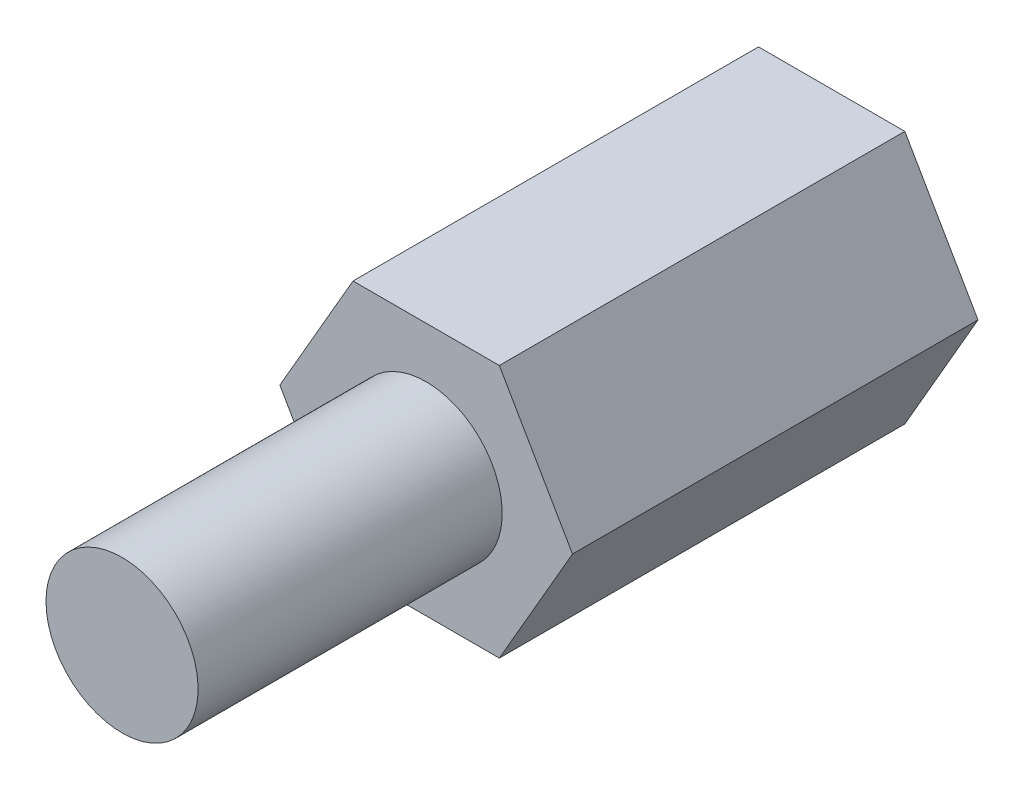
ISO-10303-21;
HEADER;
FILE_DESCRIPTION(('STEP AP214'),'2;1');
FILE_NAME('part.step','',(''),(''),'','','');
FILE_SCHEMA(('AUTOMOTIVE_DESIGN { 1 0 10303 214 1 1 1 1 }'));
ENDSEC;
DATA;
#1=APPLICATION_CONTEXT('core data for automotive mechanical design processes');
#2=APPLICATION_PROTOCOL_DEFINITION('international standard','automotive_design',2000,#1);
#3=PRODUCT_CONTEXT('',#1,'mechanical');
#4=PRODUCT('Part','Part','',(#3));
#5=PRODUCT_RELATED_PRODUCT_CATEGORY('part','',(#4));
#6=PRODUCT_DEFINITION_FORMATION('','',#4);
#7=PRODUCT_DEFINITION_CONTEXT('part definition',#1,'design');
#8=PRODUCT_DEFINITION('design','',#6,#7);
#9=PRODUCT_DEFINITION_SHAPE('','',#8);
#10=(LENGTH_UNIT() NAMED_UNIT(*) SI_UNIT(.MILLI.,.METRE.));
#11=(NAMED_UNIT(*) PLANE_ANGLE_UNIT() SI_UNIT($,.RADIAN.));
#12=(NAMED_UNIT(*) SI_UNIT($,.STERADIAN.) SOLID_ANGLE_UNIT());
#13=UNCERTAINTY_MEASURE_WITH_UNIT(LENGTH_MEASURE(1.E-05),#10,'distance_accuracy_value','');
#14=(GEOMETRIC_REPRESENTATION_CONTEXT(3) GLOBAL_UNCERTAINTY_ASSIGNED_CONTEXT((#13)) GLOBAL_UNIT_ASSIGNED_CONTEXT((#10,
#11,#12)) REPRESENTATION_CONTEXT('',''));
#15=CARTESIAN_POINT('',(0.,0.,0.));
#16=DIRECTION('',(0.,0.,1.));
#17=DIRECTION('',(1.,0.,0.));
#18=AXIS2_PLACEMENT_3D('',#15,#16,#17);
#19=CARTESIAN_POINT('',(1.44337567297406,-2.49999999999998,7.99999999999985));
#20=DIRECTION('',(0.,0.,0.999999999999998));
#21=DIRECTION('',(1.,0.,0.));
#22=AXIS2_PLACEMENT_3D('',#19,#20,#21);
#23=PLANE('',#22);
#24=DIRECTION('',(1.,0.,0.));
#25=VECTOR('',#24,1.);
#26=CARTESIAN_POINT('',(-1.4433756729741,-2.49999999999999,7.99999999999985));
#27=LINE('',#26,#25);
#28=CARTESIAN_POINT('',(-1.4433756729741,-2.49999999999999,7.99999999999985));
#29=VERTEX_POINT('',#28);
#30=CARTESIAN_POINT('',(1.44337567297406,-2.49999999999998,7.99999999999985));
#31=VERTEX_POINT('',#30);
#32=EDGE_CURVE('E119',#29,#31,#27,.T.);
#33=ORIENTED_EDGE('',*,*,#32,.T.);
#34=DIRECTION('',(0.499999999999999,0.86602540378444,0.));
#35=VECTOR('',#34,1.);
#36=CARTESIAN_POINT('',(1.44337567297406,-2.49999999999998,7.99999999999985));
#37=LINE('',#36,#35);
#38=CARTESIAN_POINT('',(2.88675134594814,0.,7.99999999999985));
#39=VERTEX_POINT('',#38);
#40=EDGE_CURVE('E121',#31,#39,#37,.T.);
#41=ORIENTED_EDGE('',*,*,#40,.T.);
#42=DIRECTION('',(-0.500000000000001,0.86602540378444,0.));
#43=VECTOR('',#42,1.);
#44=CARTESIAN_POINT('',(2.88675134594814,0.,7.99999999999985));
#45=LINE('',#44,#43);
#46=CARTESIAN_POINT('',(1.44337567297407,2.50000000000003,7.99999999999985));
#47=VERTEX_POINT('',#46);
#48=EDGE_CURVE('E123',#39,#47,#45,.T.);
#49=ORIENTED_EDGE('',*,*,#48,.T.);
#50=DIRECTION('',(-1.,0.,0.));
#51=VECTOR('',#50,1.);
#52=CARTESIAN_POINT('',(1.44337567297407,2.50000000000003,7.99999999999985));
#53=LINE('',#52,#51);
#54=CARTESIAN_POINT('',(-1.44337567297408,2.50000000000004,7.9999999999998));
#55=VERTEX_POINT('',#54);
#56=EDGE_CURVE('E125',#47,#55,#53,.T.);
#57=ORIENTED_EDGE('',*,*,#56,.T.);
#58=DIRECTION('',(-0.500000000000001,-0.86602540378444,0.));
#59=VECTOR('',#58,1.);
#60=CARTESIAN_POINT('',(-1.44337567297408,2.50000000000004,7.9999999999998));
#61=LINE('',#60,#59);
#62=CARTESIAN_POINT('',(-2.88675134594816,0.,7.99999999999985));
#63=VERTEX_POINT('',#62);
#64=EDGE_CURVE('E52',#55,#63,#61,.T.);
#65=ORIENTED_EDGE('',*,*,#64,.T.);
#66=DIRECTION('',(0.500000000000001,-0.866025403784441,0.));
#67=VECTOR('',#66,1.);
#68=CARTESIAN_POINT('',(-2.88675134594816,0.,7.99999999999985));
#69=LINE('',#68,#67);
#70=EDGE_CURVE('E47',#63,#29,#69,.T.);
#71=ORIENTED_EDGE('',*,*,#70,.T.);
#72=EDGE_LOOP('',(#33,#41,#49,#57,#65,#71));
#73=FACE_BOUND('',#72,.T.);
#74=CARTESIAN_POINT('',(0.,0.,7.99999999999985));
#75=DIRECTION('',(0.,0.,0.999999999999998));
#76=DIRECTION('',(1.,0.,0.));
#77=AXIS2_PLACEMENT_3D('',#74,#75,#76);
#78=CIRCLE('',#77,1.5);
#79=CARTESIAN_POINT('',(-1.50000000000002,0.,7.99999999999985));
#80=VERTEX_POINT('',#79);
#81=EDGE_CURVE('E98',#80,#80,#78,.T.);
#82=ORIENTED_EDGE('',*,*,#81,.F.);
#83=EDGE_LOOP('',(#82));
#84=FACE_BOUND('',#83,.T.);
#85=ADVANCED_FACE('F32',(#73,#84),#23,.T.);
#86=CARTESIAN_POINT('',(-1.4433756729741,-2.49999999999999,7.99999999999985));
#87=DIRECTION('',(0.,1.,0.));
#88=DIRECTION('',(-1.,0.,0.));
#89=AXIS2_PLACEMENT_3D('',#86,#87,#88);
#90=PLANE('',#89);
#91=DIRECTION('',(1.,0.,0.));
#92=VECTOR('',#91,1.);
#93=CARTESIAN_POINT('',(-1.44337567297406,-2.50000000000003,-2.08166817117217E-13));
#94=LINE('',#93,#92);
#95=CARTESIAN_POINT('',(-1.44337567297406,-2.50000000000003,-2.08166817117217E-13));
#96=VERTEX_POINT('',#95);
#97=CARTESIAN_POINT('',(1.44337567297406,-2.5,0.));
#98=VERTEX_POINT('',#97);
#99=EDGE_CURVE('E106',#96,#98,#94,.T.);
#100=ORIENTED_EDGE('',*,*,#99,.T.);
#101=DIRECTION('',(0.,0.,-0.999999999999998));
#102=VECTOR('',#101,1.);
#103=CARTESIAN_POINT('',(1.44337567297406,-2.49999999999998,7.99999999999985));
#104=LINE('',#103,#102);
#105=EDGE_CURVE('E11',#31,#98,#104,.T.);
#106=ORIENTED_EDGE('',*,*,#105,.F.);
#107=ORIENTED_EDGE('',*,*,#32,.F.);
#108=DIRECTION('',(0.,0.,-0.999999999999998));
#109=VECTOR('',#108,1.);
#110=CARTESIAN_POINT('',(-1.4433756729741,-2.49999999999999,7.99999999999985));
#111=LINE('',#110,#109);
#112=EDGE_CURVE('E129',#29,#96,#111,.T.);
#113=ORIENTED_EDGE('',*,*,#112,.T.);
#114=EDGE_LOOP('',(#100,#106,#107,#113));
#115=FACE_BOUND('',#114,.T.);
#116=ADVANCED_FACE('F34',(#115),#90,.F.);
#117=CARTESIAN_POINT('',(1.44337567297406,-2.49999999999998,7.99999999999985));
#118=DIRECTION('',(-0.86602540378444,0.499999999999999,0.));
#119=DIRECTION('',(-0.499999999999999,-0.86602540378444,0.));
#120=AXIS2_PLACEMENT_3D('',#117,#118,#119);
#121=PLANE('',#120);
#122=DIRECTION('',(0.499999999999999,0.86602540378444,0.));
#123=VECTOR('',#122,1.);
#124=CARTESIAN_POINT('',(1.44337567297406,-2.5,0.));
#125=LINE('',#124,#123);
#126=CARTESIAN_POINT('',(2.88675134594815,0.,0.));
#127=VERTEX_POINT('',#126);
#128=EDGE_CURVE('E109',#98,#127,#125,.T.);
#129=ORIENTED_EDGE('',*,*,#128,.T.);
#130=DIRECTION('',(0.,0.,-0.999999999999998));
#131=VECTOR('',#130,1.);
#132=CARTESIAN_POINT('',(2.88675134594814,0.,7.99999999999985));
#133=LINE('',#132,#131);
#134=EDGE_CURVE('E40',#39,#127,#133,.T.);
#135=ORIENTED_EDGE('',*,*,#134,.F.);
#136=ORIENTED_EDGE('',*,*,#40,.F.);
#137=ORIENTED_EDGE('',*,*,#105,.T.);
#138=EDGE_LOOP('',(#129,#135,#136,#137));
#139=FACE_BOUND('',#138,.T.);
#140=ADVANCED_FACE('F166',(#139),#121,.F.);
#141=CARTESIAN_POINT('',(2.88675134594814,0.,7.99999999999985));
#142=DIRECTION('',(-0.86602540378444,-0.500000000000001,0.));
#143=DIRECTION('',(0.500000000000001,-0.86602540378444,0.));
#144=AXIS2_PLACEMENT_3D('',#141,#142,#143);
#145=PLANE('',#144);
#146=DIRECTION('',(-0.500000000000001,0.86602540378444,0.));
#147=VECTOR('',#146,1.);
#148=CARTESIAN_POINT('',(2.88675134594815,0.,0.));
#149=LINE('',#148,#147);
#150=CARTESIAN_POINT('',(1.44337567297408,2.50000000000002,0.));
#151=VERTEX_POINT('',#150);
#152=EDGE_CURVE('E111',#127,#151,#149,.T.);
#153=ORIENTED_EDGE('',*,*,#152,.T.);
#154=DIRECTION('',(0.,0.,-0.999999999999998));
#155=VECTOR('',#154,1.);
#156=CARTESIAN_POINT('',(1.44337567297407,2.50000000000003,7.99999999999985));
#157=LINE('',#156,#155);
#158=EDGE_CURVE('E138',#47,#151,#157,.T.);
#159=ORIENTED_EDGE('',*,*,#158,.F.);
#160=ORIENTED_EDGE('',*,*,#48,.F.);
#161=ORIENTED_EDGE('',*,*,#134,.T.);
#162=EDGE_LOOP('',(#153,#159,#160,#161));
#163=FACE_BOUND('',#162,.T.);
#164=ADVANCED_FACE('F145',(#163),#145,.F.);
#165=CARTESIAN_POINT('',(1.44337567297407,2.50000000000003,7.99999999999985));
#166=DIRECTION('',(0.,-1.,0.));
#167=DIRECTION('',(1.,0.,0.));
#168=AXIS2_PLACEMENT_3D('',#165,#166,#167);
#169=PLANE('',#168);
#170=DIRECTION('',(-1.,0.,0.));
#171=VECTOR('',#170,1.);
#172=CARTESIAN_POINT('',(1.44337567297408,2.50000000000002,0.));
#173=LINE('',#172,#171);
#174=CARTESIAN_POINT('',(-1.44337567297405,2.50000000000003,0.));
#175=VERTEX_POINT('',#174);
#176=EDGE_CURVE('E113',#151,#175,#173,.T.);
#177=ORIENTED_EDGE('',*,*,#176,.T.);
#178=DIRECTION('',(0.,0.,-0.999999999999998));
#179=VECTOR('',#178,1.);
#180=CARTESIAN_POINT('',(-1.44337567297408,2.50000000000004,7.9999999999998));
#181=LINE('',#180,#179);
#182=EDGE_CURVE('E135',#55,#175,#181,.T.);
#183=ORIENTED_EDGE('',*,*,#182,.F.);
#184=ORIENTED_EDGE('',*,*,#56,.F.);
#185=ORIENTED_EDGE('',*,*,#158,.T.);
#186=EDGE_LOOP('',(#177,#183,#184,#185));
#187=FACE_BOUND('',#186,.T.);
#188=ADVANCED_FACE('F156',(#187),#169,.F.);
#189=CARTESIAN_POINT('',(-1.44337567297408,2.50000000000004,7.9999999999998));
#190=DIRECTION('',(0.86602540378444,-0.500000000000001,0.));
#191=DIRECTION('',(0.500000000000001,0.86602540378444,0.));
#192=AXIS2_PLACEMENT_3D('',#189,#190,#191);
#193=PLANE('',#192);
#194=DIRECTION('',(-0.500000000000001,-0.86602540378444,0.));
#195=VECTOR('',#194,1.);
#196=CARTESIAN_POINT('',(-1.44337567297405,2.50000000000003,0.));
#197=LINE('',#196,#195);
#198=CARTESIAN_POINT('',(-2.88675134594814,0.,0.));
#199=VERTEX_POINT('',#198);
#200=EDGE_CURVE('E115',#175,#199,#197,.T.);
#201=ORIENTED_EDGE('',*,*,#200,.T.);
#202=DIRECTION('',(0.,0.,-0.999999999999998));
#203=VECTOR('',#202,1.);
#204=CARTESIAN_POINT('',(-2.88675134594816,0.,7.99999999999985));
#205=LINE('',#204,#203);
#206=EDGE_CURVE('E132',#63,#199,#205,.T.);
#207=ORIENTED_EDGE('',*,*,#206,.F.);
#208=ORIENTED_EDGE('',*,*,#64,.F.);
#209=ORIENTED_EDGE('',*,*,#182,.T.);
#210=EDGE_LOOP('',(#201,#207,#208,#209));
#211=FACE_BOUND('',#210,.T.);
#212=ADVANCED_FACE('F159',(#211),#193,.F.);
#213=CARTESIAN_POINT('',(-2.88675134594816,0.,7.99999999999985));
#214=DIRECTION('',(0.866025403784441,0.500000000000001,0.));
#215=DIRECTION('',(-0.500000000000001,0.866025403784441,0.));
#216=AXIS2_PLACEMENT_3D('',#213,#214,#215);
#217=PLANE('',#216);
#218=DIRECTION('',(0.500000000000001,-0.866025403784441,0.));
#219=VECTOR('',#218,1.);
#220=CARTESIAN_POINT('',(-2.88675134594814,0.,0.));
#221=LINE('',#220,#219);
#222=EDGE_CURVE('E117',#199,#96,#221,.T.);
#223=ORIENTED_EDGE('',*,*,#222,.T.);
#224=ORIENTED_EDGE('',*,*,#112,.F.);
#225=ORIENTED_EDGE('',*,*,#70,.F.);
#226=ORIENTED_EDGE('',*,*,#206,.T.);
#227=EDGE_LOOP('',(#223,#224,#225,#226));
#228=FACE_BOUND('',#227,.T.);
#229=ADVANCED_FACE('F161',(#228),#217,.F.);
#230=CARTESIAN_POINT('',(1.44337567297406,-2.5,0.));
#231=DIRECTION('',(0.,0.,0.999999999999998));
#232=DIRECTION('',(1.,0.,0.));
#233=AXIS2_PLACEMENT_3D('',#230,#231,#232);
#234=PLANE('',#233);
#235=CARTESIAN_POINT('',(0.,0.,0.));
#236=DIRECTION('',(0.,0.,-0.999999999999998));
#237=DIRECTION('',(-1.,0.,0.));
#238=AXIS2_PLACEMENT_3D('',#235,#236,#237);
#239=CIRCLE('',#238,1.24999999999999);
#240=CARTESIAN_POINT('',(-1.24999999999999,0.,0.));
#241=VERTEX_POINT('',#240);
#242=EDGE_CURVE('E95',#241,#241,#239,.T.);
#243=ORIENTED_EDGE('',*,*,#242,.F.);
#244=EDGE_LOOP('',(#243));
#245=FACE_BOUND('',#244,.T.);
#246=ORIENTED_EDGE('',*,*,#99,.F.);
#247=ORIENTED_EDGE('',*,*,#222,.F.);
#248=ORIENTED_EDGE('',*,*,#200,.F.);
#249=ORIENTED_EDGE('',*,*,#176,.F.);
#250=ORIENTED_EDGE('',*,*,#152,.F.);
#251=ORIENTED_EDGE('',*,*,#128,.F.);
#252=EDGE_LOOP('',(#246,#247,#248,#249,#250,#251));
#253=FACE_BOUND('',#252,.T.);
#254=ADVANCED_FACE('F151',(#245,#253),#234,.F.);
#255=CARTESIAN_POINT('',(0.,0.,13.9999999999998));
#256=DIRECTION('',(0.,0.,-0.999999999999998));
#257=DIRECTION('',(-1.,0.,0.));
#258=AXIS2_PLACEMENT_3D('',#255,#256,#257);
#259=CYLINDRICAL_SURFACE('',#258,1.5);
#260=CARTESIAN_POINT('',(0.,0.,13.9999999999998));
#261=DIRECTION('',(0.,0.,0.999999999999998));
#262=DIRECTION('',(1.,0.,0.));
#263=AXIS2_PLACEMENT_3D('',#260,#261,#262);
#264=CIRCLE('',#263,1.5);
#265=CARTESIAN_POINT('',(-1.50000000000002,0.,13.9999999999998));
#266=VERTEX_POINT('',#265);
#267=EDGE_CURVE('E103',#266,#266,#264,.T.);
#268=CARTESIAN_POINT('',(-1.50000000000002,0.,13.9999999999998));
#269=CARTESIAN_POINT('',(-1.50000000000002,0.,13.9374999999998));
#270=CARTESIAN_POINT('',(-1.50000000000002,0.,13.8749999999998));
#271=CARTESIAN_POINT('',(-1.50000000000002,0.,13.7499999999998));
#272=CARTESIAN_POINT('',(-1.50000000000002,0.,13.6874999999998));
#273=CARTESIAN_POINT('',(-1.50000000000002,0.,13.5624999999998));
#274=CARTESIAN_POINT('',(-1.50000000000002,0.,13.4999999999998));
#275=CARTESIAN_POINT('',(-1.50000000000002,0.,13.3749999999998));
#276=CARTESIAN_POINT('',(-1.50000000000002,0.,13.3124999999998));
#277=CARTESIAN_POINT('',(-1.50000000000002,0.,13.1874999999998));
#278=CARTESIAN_POINT('',(-1.50000000000002,0.,13.1249999999998));
#279=CARTESIAN_POINT('',(-1.50000000000002,0.,12.9999999999998));
#280=CARTESIAN_POINT('',(-1.50000000000002,0.,12.9374999999998));
#281=CARTESIAN_POINT('',(-1.50000000000002,0.,12.8124999999998));
#282=CARTESIAN_POINT('',(-1.50000000000002,0.,12.7499999999998));
#283=CARTESIAN_POINT('',(-1.50000000000002,0.,12.6249999999998));
#284=CARTESIAN_POINT('',(-1.50000000000002,0.,12.5624999999998));
#285=CARTESIAN_POINT('',(-1.50000000000002,0.,12.4374999999998));
#286=CARTESIAN_POINT('',(-1.50000000000002,0.,12.3749999999998));
#287=CARTESIAN_POINT('',(-1.50000000000002,0.,12.2499999999998));
#288=CARTESIAN_POINT('',(-1.50000000000002,0.,12.1874999999998));
#289=CARTESIAN_POINT('',(-1.50000000000002,0.,12.0624999999998));
#290=CARTESIAN_POINT('',(-1.50000000000002,0.,11.9999999999998));
#291=CARTESIAN_POINT('',(-1.50000000000002,0.,11.8749999999998));
#292=CARTESIAN_POINT('',(-1.50000000000002,0.,11.8124999999998));
#293=CARTESIAN_POINT('',(-1.50000000000002,0.,11.6874999999998));
#294=CARTESIAN_POINT('',(-1.50000000000002,0.,11.6249999999998));
#295=CARTESIAN_POINT('',(-1.50000000000002,0.,11.4999999999998));
#296=CARTESIAN_POINT('',(-1.50000000000002,0.,11.4374999999998));
#297=CARTESIAN_POINT('',(-1.50000000000002,0.,11.3124999999998));
#298=CARTESIAN_POINT('',(-1.50000000000002,0.,11.2499999999998));
#299=CARTESIAN_POINT('',(-1.50000000000002,0.,11.1249999999998));
#300=CARTESIAN_POINT('',(-1.50000000000002,0.,11.0624999999998));
#301=CARTESIAN_POINT('',(-1.50000000000002,0.,10.9374999999998));
#302=CARTESIAN_POINT('',(-1.50000000000002,0.,10.8749999999998));
#303=CARTESIAN_POINT('',(-1.50000000000002,0.,10.7499999999998));
#304=CARTESIAN_POINT('',(-1.50000000000002,0.,10.6874999999998));
#305=CARTESIAN_POINT('',(-1.50000000000002,0.,10.5624999999998));
#306=CARTESIAN_POINT('',(-1.50000000000002,0.,10.4999999999998));
#307=CARTESIAN_POINT('',(-1.50000000000002,0.,10.3749999999998));
#308=CARTESIAN_POINT('',(-1.50000000000002,0.,10.3124999999998));
#309=CARTESIAN_POINT('',(-1.50000000000002,0.,10.1874999999998));
#310=CARTESIAN_POINT('',(-1.50000000000002,0.,10.1249999999998));
#311=CARTESIAN_POINT('',(-1.50000000000002,0.,9.99999999999985));
#312=CARTESIAN_POINT('',(-1.50000000000002,0.,9.93749999999985));
#313=CARTESIAN_POINT('',(-1.50000000000002,0.,9.81249999999985));
#314=CARTESIAN_POINT('',(-1.50000000000002,0.,9.74999999999985));
#315=CARTESIAN_POINT('',(-1.50000000000002,0.,9.62499999999985));
#316=CARTESIAN_POINT('',(-1.50000000000002,0.,9.56249999999985));
#317=CARTESIAN_POINT('',(-1.50000000000002,0.,9.43749999999985));
#318=CARTESIAN_POINT('',(-1.50000000000002,0.,9.37499999999985));
#319=CARTESIAN_POINT('',(-1.50000000000002,0.,9.24999999999985));
#320=CARTESIAN_POINT('',(-1.50000000000002,0.,9.18749999999985));
#321=CARTESIAN_POINT('',(-1.50000000000002,0.,9.06249999999985));
#322=CARTESIAN_POINT('',(-1.50000000000002,0.,8.99999999999985));
#323=CARTESIAN_POINT('',(-1.50000000000002,0.,8.87499999999985));
#324=CARTESIAN_POINT('',(-1.50000000000002,0.,8.81249999999985));
#325=CARTESIAN_POINT('',(-1.50000000000002,0.,8.68749999999985));
#326=CARTESIAN_POINT('',(-1.50000000000002,0.,8.62499999999985));
#327=CARTESIAN_POINT('',(-1.50000000000002,0.,8.49999999999985));
#328=CARTESIAN_POINT('',(-1.50000000000002,0.,8.43749999999984));
#329=CARTESIAN_POINT('',(-1.50000000000002,0.,8.31249999999984));
#330=CARTESIAN_POINT('',(-1.50000000000002,0.,8.24999999999984));
#331=CARTESIAN_POINT('',(-1.50000000000002,0.,8.12499999999984));
#332=CARTESIAN_POINT('',(-1.50000000000002,0.,8.06249999999985));
#333=CARTESIAN_POINT('',(-1.50000000000002,0.,7.99999999999985));
#334=B_SPLINE_CURVE_WITH_KNOTS('',3,(#268,#269,#270,#271,#272,#273,#274,#275,#276,#277,#278,
#279,#280,#281,#282,#283,#284,#285,#286,#287,#288,#289,#290,#291,#292,#293,#294,#295,#296,#297,
#298,#299,#300,#301,#302,#303,#304,#305,#306,#307,#308,#309,#310,#311,#312,#313,#314,#315,#316,
#317,#318,#319,#320,#321,#322,#323,#324,#325,#326,#327,#328,#329,#330,#331,#332,#333),
.UNSPECIFIED.,.F.,.F.,(4,2,2,2,2,2,2,2,2,2,2,2,2,2,2,2,2,2,2,2,2,2,2,2,2,2,2,2,2,2,2,2,4),(0.,
0.1875,0.375,0.5625,0.750000000000001,0.937500000000001,1.125,1.3125,1.5,1.6875,1.875,2.0625,
2.25,2.4375,2.625,2.8125,3.,3.1875,3.375,3.5625,3.75,3.9375,4.125,4.3125,4.5,4.6875,4.875,
5.0625,5.25,5.4375,5.625,5.8125,6.),.UNSPECIFIED.);
#335=EDGE_CURVE('BSEAM203',#266,#80,#334,.T.);
#336=ORIENTED_EDGE('',*,*,#267,.F.);
#337=ORIENTED_EDGE('',*,*,#81,.T.);
#338=ORIENTED_EDGE('',*,*,#335,.T.);
#339=ORIENTED_EDGE('',*,*,#335,.F.);
#340=EDGE_LOOP('',(#336,#338,#337,#339));
#341=FACE_BOUND('',#340,.T.);
#342=ADVANCED_FACE('F203',(#341),#259,.T.);
#343=CARTESIAN_POINT('',(0.,0.,13.9999999999998));
#344=DIRECTION('',(0.,0.,0.999999999999998));
#345=DIRECTION('',(1.,0.,0.));
#346=AXIS2_PLACEMENT_3D('',#343,#344,#345);
#347=PLANE('',#346);
#348=ORIENTED_EDGE('',*,*,#267,.T.);
#349=EDGE_LOOP('',(#348));
#350=FACE_BOUND('',#349,.T.);
#351=ADVANCED_FACE('F210',(#350),#347,.T.);
#352=CARTESIAN_POINT('',(0.,0.,0.));
#353=DIRECTION('',(0.,0.,-0.999999999999998));
#354=DIRECTION('',(-1.,0.,0.));
#355=AXIS2_PLACEMENT_3D('',#352,#353,#354);
#356=CYLINDRICAL_SURFACE('',#355,1.24999999999999);
#357=CARTESIAN_POINT('',(0.,0.,6.49999999999985));
#358=DIRECTION('',(0.,0.,-0.999999999999998));
#359=DIRECTION('',(-1.,0.,0.));
#360=AXIS2_PLACEMENT_3D('',#357,#358,#359);
#361=CIRCLE('',#360,1.25);
#362=CARTESIAN_POINT('',(-1.24999999999999,0.,6.49999999999985));
#363=VERTEX_POINT('',#362);
#364=EDGE_CURVE('E93',#363,#363,#361,.T.);
#365=CARTESIAN_POINT('',(-1.24999999999999,0.,6.49999999999985));
#366=CARTESIAN_POINT('',(-1.24999999999999,0.,6.43229166666651));
#367=CARTESIAN_POINT('',(-1.24999999999999,0.,6.36458333333318));
#368=CARTESIAN_POINT('',(-1.24999999999999,0.,6.22916666666652));
#369=CARTESIAN_POINT('',(-1.24999999999999,0.,6.16145833333319));
#370=CARTESIAN_POINT('',(-1.24999999999999,0.,6.02604166666652));
#371=CARTESIAN_POINT('',(-1.24999999999999,0.,5.95833333333319));
#372=CARTESIAN_POINT('',(-1.24999999999999,0.,5.82291666666653));
#373=CARTESIAN_POINT('',(-1.24999999999999,0.,5.7552083333332));
#374=CARTESIAN_POINT('',(-1.24999999999999,0.,5.61979166666654));
#375=CARTESIAN_POINT('',(-1.24999999999999,0.,5.55208333333321));
#376=CARTESIAN_POINT('',(-1.24999999999999,0.,5.41666666666654));
#377=CARTESIAN_POINT('',(-1.24999999999999,0.,5.34895833333321));
#378=CARTESIAN_POINT('',(-1.24999999999999,0.,5.21354166666655));
#379=CARTESIAN_POINT('',(-1.24999999999999,0.,5.14583333333322));
#380=CARTESIAN_POINT('',(-1.24999999999999,0.,5.01041666666655));
#381=CARTESIAN_POINT('',(-1.24999999999999,0.,4.94270833333322));
#382=CARTESIAN_POINT('',(-1.24999999999999,0.,4.80729166666656));
#383=CARTESIAN_POINT('',(-1.24999999999999,0.,4.73958333333323));
#384=CARTESIAN_POINT('',(-1.24999999999999,0.,4.60416666666657));
#385=CARTESIAN_POINT('',(-1.24999999999999,0.,4.53645833333323));
#386=CARTESIAN_POINT('',(-1.24999999999999,0.,4.40104166666657));
#387=CARTESIAN_POINT('',(-1.24999999999999,0.,4.33333333333324));
#388=CARTESIAN_POINT('',(-1.24999999999999,0.,4.19791666666658));
#389=CARTESIAN_POINT('',(-1.24999999999999,0.,4.13020833333325));
#390=CARTESIAN_POINT('',(-1.24999999999999,0.,3.99479166666658));
#391=CARTESIAN_POINT('',(-1.24999999999999,0.,3.92708333333325));
#392=CARTESIAN_POINT('',(-1.24999999999999,0.,3.79166666666659));
#393=CARTESIAN_POINT('',(-1.24999999999999,0.,3.72395833333326));
#394=CARTESIAN_POINT('',(-1.24999999999999,0.,3.58854166666659));
#395=CARTESIAN_POINT('',(-1.24999999999999,0.,3.52083333333326));
#396=CARTESIAN_POINT('',(-1.24999999999999,0.,3.3854166666666));
#397=CARTESIAN_POINT('',(-1.24999999999999,0.,3.31770833333327));
#398=CARTESIAN_POINT('',(-1.24999999999999,0.,3.18229166666661));
#399=CARTESIAN_POINT('',(-1.24999999999999,0.,3.11458333333327));
#400=CARTESIAN_POINT('',(-1.24999999999999,0.,2.97916666666661));
#401=CARTESIAN_POINT('',(-1.24999999999999,0.,2.91145833333328));
#402=CARTESIAN_POINT('',(-1.24999999999999,0.,2.77604166666662));
#403=CARTESIAN_POINT('',(-1.24999999999999,0.,2.70833333333329));
#404=CARTESIAN_POINT('',(-1.24999999999999,0.,2.57291666666662));
#405=CARTESIAN_POINT('',(-1.24999999999999,0.,2.50520833333329));
#406=CARTESIAN_POINT('',(-1.24999999999999,0.,2.36979166666663));
#407=CARTESIAN_POINT('',(-1.24999999999999,0.,2.3020833333333));
#408=CARTESIAN_POINT('',(-1.24999999999999,0.,2.16666666666663));
#409=CARTESIAN_POINT('',(-1.24999999999999,0.,2.0989583333333));
#410=CARTESIAN_POINT('',(-1.24999999999999,0.,1.96354166666664));
#411=CARTESIAN_POINT('',(-1.24999999999999,0.,1.89583333333331));
#412=CARTESIAN_POINT('',(-1.24999999999999,0.,1.76041666666664));
#413=CARTESIAN_POINT('',(-1.24999999999999,0.,1.69270833333331));
#414=CARTESIAN_POINT('',(-1.24999999999999,0.,1.55729166666665));
#415=CARTESIAN_POINT('',(-1.24999999999999,0.,1.48958333333332));
#416=CARTESIAN_POINT('',(-1.24999999999999,0.,1.35416666666666));
#417=CARTESIAN_POINT('',(-1.24999999999999,0.,1.28645833333333));
#418=CARTESIAN_POINT('',(-1.24999999999999,0.,1.15104166666666));
#419=CARTESIAN_POINT('',(-1.24999999999999,0.,1.08333333333333));
#420=CARTESIAN_POINT('',(-1.24999999999999,0.,0.947916666666668));
#421=CARTESIAN_POINT('',(-1.24999999999999,0.,0.880208333333336));
#422=CARTESIAN_POINT('',(-1.24999999999999,0.,0.744791666666674));
#423=CARTESIAN_POINT('',(-1.24999999999999,0.,0.677083333333342));
#424=CARTESIAN_POINT('',(-1.24999999999999,0.,0.541666666666679));
#425=CARTESIAN_POINT('',(-1.24999999999999,0.,0.473958333333348));
#426=CARTESIAN_POINT('',(-1.24999999999999,0.,0.338541666666685));
#427=CARTESIAN_POINT('',(-1.24999999999999,0.,0.270833333333354));
#428=CARTESIAN_POINT('',(-1.24999999999999,0.,0.135416666666691));
#429=CARTESIAN_POINT('',(-1.24999999999999,0.,0.0677083333333592));
#430=CARTESIAN_POINT('',(-1.24999999999999,0.,0.));
#431=B_SPLINE_CURVE_WITH_KNOTS('',3,(#365,#366,#367,#368,#369,#370,#371,#372,#373,#374,#375,
#376,#377,#378,#379,#380,#381,#382,#383,#384,#385,#386,#387,#388,#389,#390,#391,#392,#393,#394,
#395,#396,#397,#398,#399,#400,#401,#402,#403,#404,#405,#406,#407,#408,#409,#410,#411,#412,#413,
#414,#415,#416,#417,#418,#419,#420,#421,#422,#423,#424,#425,#426,#427,#428,#429,#430),
.UNSPECIFIED.,.F.,.F.,(4,2,2,2,2,2,2,2,2,2,2,2,2,2,2,2,2,2,2,2,2,2,2,2,2,2,2,2,2,2,2,2,4),(0.,
0.203124999999995,0.406249999999988,0.609374999999983,0.812499999999977,1.01562499999997,
1.21874999999997,1.42187499999996,1.62499999999995,1.82812499999995,2.03124999999994,
2.23437499999994,2.43749999999993,2.64062499999993,2.84374999999992,3.04687499999991,
3.24999999999991,3.4531249999999,3.6562499999999,3.85937499999989,4.06249999999989,
4.26562499999988,4.46874999999987,4.67187499999987,4.87499999999986,5.07812499999986,
5.28124999999985,5.48437499999985,5.68749999999984,5.89062499999983,6.09374999999983,
6.29687499999982,6.49999999999982),.UNSPECIFIED.);
#432=EDGE_CURVE('BSEAM89',#363,#241,#431,.T.);
#433=ORIENTED_EDGE('',*,*,#364,.F.);
#434=ORIENTED_EDGE('',*,*,#242,.T.);
#435=ORIENTED_EDGE('',*,*,#432,.T.);
#436=ORIENTED_EDGE('',*,*,#432,.F.);
#437=EDGE_LOOP('',(#433,#435,#434,#436));
#438=FACE_BOUND('',#437,.T.);
#439=ADVANCED_FACE('F89',(#438),#356,.F.);
#440=CARTESIAN_POINT('',(0.,0.,6.49999999999985));
#441=DIRECTION('',(0.,0.,-0.999999999999998));
#442=DIRECTION('',(-1.,0.,0.));
#443=AXIS2_PLACEMENT_3D('',#440,#441,#442);
#444=CONICAL_SURFACE('',#443,1.25,1.02974425867665);
#445=CARTESIAN_POINT('',(0.,0.,7.2510757737843));
#446=VERTEX_POINT('',#445);
#447=VERTEX_LOOP('',#446);
#448=FACE_BOUND('',#447,.T.);
#449=ORIENTED_EDGE('',*,*,#364,.T.);
#450=EDGE_LOOP('',(#449));
#451=FACE_BOUND('',#450,.T.);
#452=ADVANCED_FACE('F86',(#448,#451),#444,.F.);
#453=CLOSED_SHELL('',(#85,#116,#140,#164,#188,#212,#229,#254,#342,#351,#439,#452));
#454=MANIFOLD_SOLID_BREP('B2',#453);
#455=ADVANCED_BREP_SHAPE_REPRESENTATION('',(#18,#454),#14);
#456=SHAPE_DEFINITION_REPRESENTATION(#9,#455);
ENDSEC;
END-ISO-10303-21;
